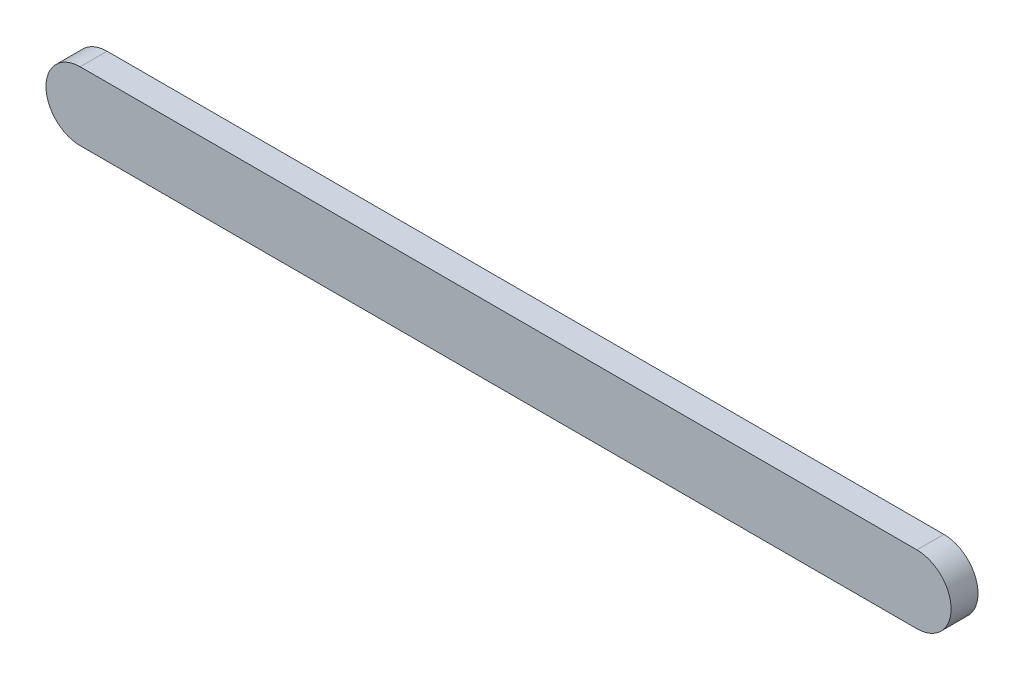
ISO-10303-21;
HEADER;
FILE_DESCRIPTION(('STEP AP214'),'2;1');
FILE_NAME('part.step','',(''),(''),'','','');
FILE_SCHEMA(('AUTOMOTIVE_DESIGN { 1 0 10303 214 1 1 1 1 }'));
ENDSEC;
DATA;
#1=APPLICATION_CONTEXT('core data for automotive mechanical design processes');
#2=APPLICATION_PROTOCOL_DEFINITION('international standard','automotive_design',2000,#1);
#3=PRODUCT_CONTEXT('',#1,'mechanical');
#4=PRODUCT('Part','Part','',(#3));
#5=PRODUCT_RELATED_PRODUCT_CATEGORY('part','',(#4));
#6=PRODUCT_DEFINITION_FORMATION('','',#4);
#7=PRODUCT_DEFINITION_CONTEXT('part definition',#1,'design');
#8=PRODUCT_DEFINITION('design','',#6,#7);
#9=PRODUCT_DEFINITION_SHAPE('','',#8);
#10=(LENGTH_UNIT() NAMED_UNIT(*) SI_UNIT(.MILLI.,.METRE.));
#11=(NAMED_UNIT(*) PLANE_ANGLE_UNIT() SI_UNIT($,.RADIAN.));
#12=(NAMED_UNIT(*) SI_UNIT($,.STERADIAN.) SOLID_ANGLE_UNIT());
#13=UNCERTAINTY_MEASURE_WITH_UNIT(LENGTH_MEASURE(1.E-05),#10,'distance_accuracy_value','');
#14=(GEOMETRIC_REPRESENTATION_CONTEXT(3) GLOBAL_UNCERTAINTY_ASSIGNED_CONTEXT((#13)) GLOBAL_UNIT_ASSIGNED_CONTEXT((#10,
#11,#12)) REPRESENTATION_CONTEXT('',''));
#15=CARTESIAN_POINT('',(0.,0.,0.));
#16=DIRECTION('',(0.,0.,1.));
#17=DIRECTION('',(1.,0.,0.));
#18=AXIS2_PLACEMENT_3D('',#15,#16,#17);
#19=CARTESIAN_POINT('',(127.57300114,119.69900114,0.));
#20=DIRECTION('',(0.,1.,0.));
#21=DIRECTION('',(1.,0.,0.));
#22=AXIS2_PLACEMENT_3D('',#19,#20,#21);
#23=PLANE('',#22);
#24=DIRECTION('',(1.,0.,0.));
#25=VECTOR('',#24,1.);
#26=CARTESIAN_POINT('',(127.57300114,119.69900114,0.1999996));
#27=LINE('',#26,#25);
#28=CARTESIAN_POINT('',(127.57300114,119.69900114,0.1999996));
#29=VERTEX_POINT('',#28);
#30=CARTESIAN_POINT('',(133.79299886,119.69900114,0.1999996));
#31=VERTEX_POINT('',#30);
#32=EDGE_CURVE('E11',#29,#31,#27,.T.);
#33=ORIENTED_EDGE('',*,*,#32,.F.);
#34=DIRECTION('',(0.,0.,1.));
#35=VECTOR('',#34,1.);
#36=CARTESIAN_POINT('',(127.57300114,119.69900114,0.));
#37=LINE('',#36,#35);
#38=CARTESIAN_POINT('',(127.57300114,119.69900114,0.));
#39=VERTEX_POINT('',#38);
#40=EDGE_CURVE('E24',#39,#29,#37,.T.);
#41=ORIENTED_EDGE('',*,*,#40,.F.);
#42=DIRECTION('',(1.,0.,0.));
#43=VECTOR('',#42,1.);
#44=CARTESIAN_POINT('',(127.57300114,119.69900114,0.));
#45=LINE('',#44,#43);
#46=CARTESIAN_POINT('',(133.79299886,119.69900114,0.));
#47=VERTEX_POINT('',#46);
#48=EDGE_CURVE('E75',#39,#47,#45,.T.);
#49=ORIENTED_EDGE('',*,*,#48,.T.);
#50=DIRECTION('',(0.,0.,1.));
#51=VECTOR('',#50,1.);
#52=CARTESIAN_POINT('',(133.79299886,119.69900114,0.));
#53=LINE('',#52,#51);
#54=EDGE_CURVE('E37',#47,#31,#53,.T.);
#55=ORIENTED_EDGE('',*,*,#54,.T.);
#56=EDGE_LOOP('',(#33,#41,#49,#55));
#57=FACE_BOUND('',#56,.T.);
#58=ADVANCED_FACE('F17',(#57),#23,.F.);
#59=CARTESIAN_POINT('',(133.79299886,119.95300114,0.));
#60=DIRECTION('',(0.,0.,-1.));
#61=DIRECTION('',(0.,-1.,0.));
#62=AXIS2_PLACEMENT_3D('',#59,#60,#61);
#63=CYLINDRICAL_SURFACE('',#62,0.254);
#64=CARTESIAN_POINT('',(133.79299886,119.95300114,0.1999996));
#65=DIRECTION('',(0.,0.,1.));
#66=DIRECTION('',(0.,-1.,0.));
#67=AXIS2_PLACEMENT_3D('',#64,#65,#66);
#68=CIRCLE('',#67,0.254);
#69=CARTESIAN_POINT('',(133.79299886,120.20700114,0.1999996));
#70=VERTEX_POINT('',#69);
#71=EDGE_CURVE('E83',#31,#70,#68,.T.);
#72=ORIENTED_EDGE('',*,*,#71,.F.);
#73=ORIENTED_EDGE('',*,*,#54,.F.);
#74=CARTESIAN_POINT('',(133.79299886,119.95300114,0.));
#75=DIRECTION('',(0.,0.,1.));
#76=DIRECTION('',(0.,-1.,0.));
#77=AXIS2_PLACEMENT_3D('',#74,#75,#76);
#78=CIRCLE('',#77,0.254);
#79=CARTESIAN_POINT('',(133.79299886,120.20700114,0.));
#80=VERTEX_POINT('',#79);
#81=EDGE_CURVE('E81',#47,#80,#78,.T.);
#82=ORIENTED_EDGE('',*,*,#81,.T.);
#83=DIRECTION('',(0.,0.,1.));
#84=VECTOR('',#83,1.);
#85=CARTESIAN_POINT('',(133.79299886,120.20700114,0.));
#86=LINE('',#85,#84);
#87=EDGE_CURVE('E67',#80,#70,#86,.T.);
#88=ORIENTED_EDGE('',*,*,#87,.T.);
#89=EDGE_LOOP('',(#72,#73,#82,#88));
#90=FACE_BOUND('',#89,.T.);
#91=ADVANCED_FACE('F89',(#90),#63,.T.);
#92=CARTESIAN_POINT('',(133.79299886,120.20700114,0.));
#93=DIRECTION('',(0.,-1.,0.));
#94=DIRECTION('',(-1.,0.,0.));
#95=AXIS2_PLACEMENT_3D('',#92,#93,#94);
#96=PLANE('',#95);
#97=DIRECTION('',(-1.,0.,0.));
#98=VECTOR('',#97,1.);
#99=CARTESIAN_POINT('',(133.79299886,120.20700114,0.1999996));
#100=LINE('',#99,#98);
#101=CARTESIAN_POINT('',(127.57300114,120.20700114,0.1999996));
#102=VERTEX_POINT('',#101);
#103=EDGE_CURVE('E71',#70,#102,#100,.T.);
#104=ORIENTED_EDGE('',*,*,#103,.F.);
#105=ORIENTED_EDGE('',*,*,#87,.F.);
#106=DIRECTION('',(-1.,0.,0.));
#107=VECTOR('',#106,1.);
#108=CARTESIAN_POINT('',(133.79299886,120.20700114,0.));
#109=LINE('',#108,#107);
#110=CARTESIAN_POINT('',(127.57300114,120.20700114,0.));
#111=VERTEX_POINT('',#110);
#112=EDGE_CURVE('E63',#80,#111,#109,.T.);
#113=ORIENTED_EDGE('',*,*,#112,.T.);
#114=DIRECTION('',(0.,0.,1.));
#115=VECTOR('',#114,1.);
#116=CARTESIAN_POINT('',(127.57300114,120.20700114,0.));
#117=LINE('',#116,#115);
#118=EDGE_CURVE('E53',#111,#102,#117,.T.);
#119=ORIENTED_EDGE('',*,*,#118,.T.);
#120=EDGE_LOOP('',(#104,#105,#113,#119));
#121=FACE_BOUND('',#120,.T.);
#122=ADVANCED_FACE('F66',(#121),#96,.F.);
#123=CARTESIAN_POINT('',(127.57300114,119.95300114,0.));
#124=DIRECTION('',(0.,0.,-1.));
#125=DIRECTION('',(0.,1.,0.));
#126=AXIS2_PLACEMENT_3D('',#123,#124,#125);
#127=CYLINDRICAL_SURFACE('',#126,0.254000000000005);
#128=CARTESIAN_POINT('',(127.57300114,119.95300114,0.1999996));
#129=DIRECTION('',(0.,0.,1.));
#130=DIRECTION('',(0.,1.,0.));
#131=AXIS2_PLACEMENT_3D('',#128,#129,#130);
#132=CIRCLE('',#131,0.254000000000005);
#133=EDGE_CURVE('E59',#102,#29,#132,.T.);
#134=ORIENTED_EDGE('',*,*,#133,.F.);
#135=ORIENTED_EDGE('',*,*,#118,.F.);
#136=CARTESIAN_POINT('',(127.57300114,119.95300114,0.));
#137=DIRECTION('',(0.,0.,1.));
#138=DIRECTION('',(0.,1.,0.));
#139=AXIS2_PLACEMENT_3D('',#136,#137,#138);
#140=CIRCLE('',#139,0.254000000000005);
#141=EDGE_CURVE('E57',#111,#39,#140,.T.);
#142=ORIENTED_EDGE('',*,*,#141,.T.);
#143=ORIENTED_EDGE('',*,*,#40,.T.);
#144=EDGE_LOOP('',(#134,#135,#142,#143));
#145=FACE_BOUND('',#144,.T.);
#146=ADVANCED_FACE('F55',(#145),#127,.T.);
#147=CARTESIAN_POINT('',(127.57300114,119.69900114,0.));
#148=DIRECTION('',(0.,0.,-1.));
#149=DIRECTION('',(-1.,0.,0.));
#150=AXIS2_PLACEMENT_3D('',#147,#148,#149);
#151=PLANE('',#150);
#152=ORIENTED_EDGE('',*,*,#141,.F.);
#153=ORIENTED_EDGE('',*,*,#112,.F.);
#154=ORIENTED_EDGE('',*,*,#81,.F.);
#155=ORIENTED_EDGE('',*,*,#48,.F.);
#156=EDGE_LOOP('',(#152,#153,#154,#155));
#157=FACE_BOUND('',#156,.T.);
#158=ADVANCED_FACE('F74',(#157),#151,.T.);
#159=CARTESIAN_POINT('',(127.57300114,119.69900114,0.1999996));
#160=DIRECTION('',(0.,0.,-1.));
#161=DIRECTION('',(-1.,0.,0.));
#162=AXIS2_PLACEMENT_3D('',#159,#160,#161);
#163=PLANE('',#162);
#164=ORIENTED_EDGE('',*,*,#32,.T.);
#165=ORIENTED_EDGE('',*,*,#71,.T.);
#166=ORIENTED_EDGE('',*,*,#103,.T.);
#167=ORIENTED_EDGE('',*,*,#133,.T.);
#168=EDGE_LOOP('',(#164,#165,#166,#167));
#169=FACE_BOUND('',#168,.T.);
#170=ADVANCED_FACE('F91',(#169),#163,.F.);
#171=CLOSED_SHELL('',(#58,#91,#122,#146,#158,#170));
#172=MANIFOLD_SOLID_BREP('B1',#171);
#173=ADVANCED_BREP_SHAPE_REPRESENTATION('',(#18,#172),#14);
#174=SHAPE_DEFINITION_REPRESENTATION(#9,#173);
ENDSEC;
END-ISO-10303-21;
